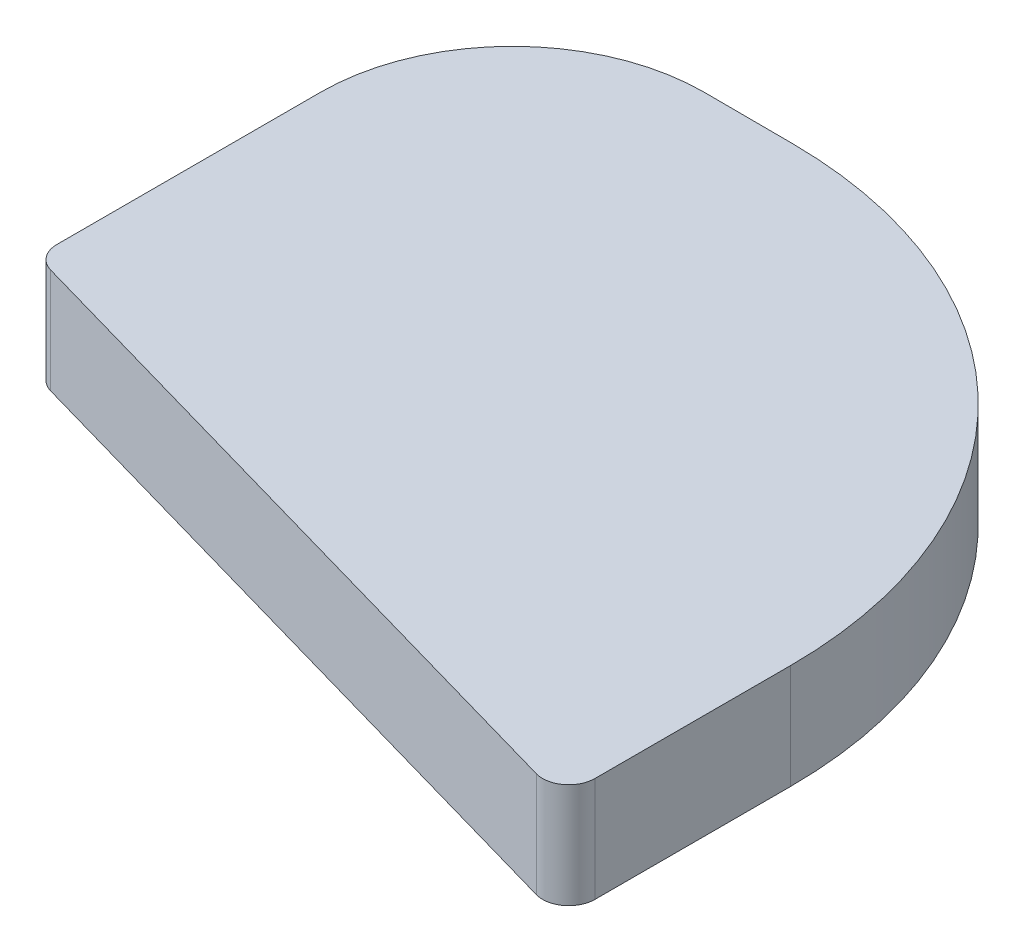
ISO-10303-21;
HEADER;
FILE_DESCRIPTION(('STEP AP214'),'2;1');
FILE_NAME('part.step','',(''),(''),'','','');
FILE_SCHEMA(('AUTOMOTIVE_DESIGN { 1 0 10303 214 1 1 1 1 }'));
ENDSEC;
DATA;
#1=APPLICATION_CONTEXT('core data for automotive mechanical design processes');
#2=APPLICATION_PROTOCOL_DEFINITION('international standard','automotive_design',2000,#1);
#3=PRODUCT_CONTEXT('',#1,'mechanical');
#4=PRODUCT('Part','Part','',(#3));
#5=PRODUCT_RELATED_PRODUCT_CATEGORY('part','',(#4));
#6=PRODUCT_DEFINITION_FORMATION('','',#4);
#7=PRODUCT_DEFINITION_CONTEXT('part definition',#1,'design');
#8=PRODUCT_DEFINITION('design','',#6,#7);
#9=PRODUCT_DEFINITION_SHAPE('','',#8);
#10=(LENGTH_UNIT() NAMED_UNIT(*) SI_UNIT(.MILLI.,.METRE.));
#11=(NAMED_UNIT(*) PLANE_ANGLE_UNIT() SI_UNIT($,.RADIAN.));
#12=(NAMED_UNIT(*) SI_UNIT($,.STERADIAN.) SOLID_ANGLE_UNIT());
#13=UNCERTAINTY_MEASURE_WITH_UNIT(LENGTH_MEASURE(1.E-05),#10,'distance_accuracy_value','');
#14=(GEOMETRIC_REPRESENTATION_CONTEXT(3) GLOBAL_UNCERTAINTY_ASSIGNED_CONTEXT((#13)) GLOBAL_UNIT_ASSIGNED_CONTEXT((#10,
#11,#12)) REPRESENTATION_CONTEXT('',''));
#15=CARTESIAN_POINT('',(0.,0.,0.));
#16=DIRECTION('',(0.,0.,1.));
#17=DIRECTION('',(1.,0.,0.));
#18=AXIS2_PLACEMENT_3D('',#15,#16,#17);
#19=CARTESIAN_POINT('',(-0.380127492938181,2.9956,-3.1192056864285));
#20=DIRECTION('',(0.,-1.,0.));
#21=DIRECTION('',(-1.,0.,0.));
#22=AXIS2_PLACEMENT_3D('',#19,#20,#21);
#23=CYLINDRICAL_SURFACE('',#22,0.281081081081106);
#24=CARTESIAN_POINT('',(-0.380127492938181,2.9306,-3.1192056864285));
#25=DIRECTION('',(0.,1.,0.));
#26=DIRECTION('',(1.,0.,0.));
#27=AXIS2_PLACEMENT_3D('',#24,#25,#26);
#28=CIRCLE('',#27,0.281081081081106);
#29=CARTESIAN_POINT('',(-0.0990464118570747,2.9306,-3.1192056864286));
#30=VERTEX_POINT('',#29);
#31=CARTESIAN_POINT('',(-0.37910340221781,2.9306,-3.4002849019176));
#32=VERTEX_POINT('',#31);
#33=EDGE_CURVE('E11',#30,#32,#28,.T.);
#34=ORIENTED_EDGE('',*,*,#33,.T.);
#35=DIRECTION('',(0.,-1.,0.));
#36=VECTOR('',#35,1.);
#37=CARTESIAN_POINT('',(-0.37910340221781,2.9956,-3.4002849019176));
#38=LINE('',#37,#36);
#39=CARTESIAN_POINT('',(-0.37910340221781,2.9956,-3.4002849019176));
#40=VERTEX_POINT('',#39);
#41=EDGE_CURVE('E24',#40,#32,#38,.T.);
#42=ORIENTED_EDGE('',*,*,#41,.F.);
#43=CARTESIAN_POINT('',(-0.380127492938181,2.9956,-3.1192056864285));
#44=DIRECTION('',(0.,1.,0.));
#45=DIRECTION('',(1.,0.,0.));
#46=AXIS2_PLACEMENT_3D('',#43,#44,#45);
#47=CIRCLE('',#46,0.281081081081106);
#48=CARTESIAN_POINT('',(-0.0990464118570747,2.9956,-3.1192056864286));
#49=VERTEX_POINT('',#48);
#50=EDGE_CURVE('E144',#49,#40,#47,.T.);
#51=ORIENTED_EDGE('',*,*,#50,.F.);
#52=DIRECTION('',(0.,-1.,0.));
#53=VECTOR('',#52,1.);
#54=CARTESIAN_POINT('',(-0.0990464118570747,2.9956,-3.1192056864286));
#55=LINE('',#54,#53);
#56=EDGE_CURVE('E102',#49,#30,#55,.T.);
#57=ORIENTED_EDGE('',*,*,#56,.T.);
#58=EDGE_LOOP('',(#34,#42,#51,#57));
#59=FACE_BOUND('',#58,.T.);
#60=ADVANCED_FACE('F17',(#59),#23,.T.);
#61=CARTESIAN_POINT('',(-0.37910340221781,2.9956,-3.4002849019176));
#62=DIRECTION('',(-0.0036433996779799,0.,0.999993362797367));
#63=DIRECTION('',(0.999993362797367,0.,0.0036433996779799));
#64=AXIS2_PLACEMENT_3D('',#61,#62,#63);
#65=PLANE('',#64);
#66=DIRECTION('',(-0.999993362797367,0.,-0.0036433996779799));
#67=VECTOR('',#66,1.);
#68=CARTESIAN_POINT('',(-0.37910340221781,2.9306,-3.4002849019176));
#69=LINE('',#68,#67);
#70=CARTESIAN_POINT('',(-0.433620918176787,2.9306,-3.400483532336));
#71=VERTEX_POINT('',#70);
#72=EDGE_CURVE('E141',#32,#71,#69,.T.);
#73=ORIENTED_EDGE('',*,*,#72,.T.);
#74=DIRECTION('',(0.,-1.,0.));
#75=VECTOR('',#74,1.);
#76=CARTESIAN_POINT('',(-0.433620918176787,2.9956,-3.400483532336));
#77=LINE('',#76,#75);
#78=CARTESIAN_POINT('',(-0.433620918176787,2.9956,-3.400483532336));
#79=VERTEX_POINT('',#78);
#80=EDGE_CURVE('E138',#79,#71,#77,.T.);
#81=ORIENTED_EDGE('',*,*,#80,.F.);
#82=DIRECTION('',(-0.999993362797367,0.,-0.0036433996779799));
#83=VECTOR('',#82,1.);
#84=CARTESIAN_POINT('',(-0.37910340221781,2.9956,-3.4002849019176));
#85=LINE('',#84,#83);
#86=EDGE_CURVE('E135',#40,#79,#85,.T.);
#87=ORIENTED_EDGE('',*,*,#86,.F.);
#88=ORIENTED_EDGE('',*,*,#41,.T.);
#89=EDGE_LOOP('',(#73,#81,#87,#88));
#90=FACE_BOUND('',#89,.T.);
#91=ADVANCED_FACE('F147',(#90),#65,.F.);
#92=CARTESIAN_POINT('',(-0.434054187327782,2.9956,-3.281565402706));
#93=DIRECTION('',(0.,-1.,0.));
#94=DIRECTION('',(-1.,0.,0.));
#95=AXIS2_PLACEMENT_3D('',#92,#93,#94);
#96=CYLINDRICAL_SURFACE('',#95,0.118918918918943);
#97=CARTESIAN_POINT('',(-0.434054187327782,2.9306,-3.281565402706));
#98=DIRECTION('',(0.,1.,0.));
#99=DIRECTION('',(1.,0.,0.));
#100=AXIS2_PLACEMENT_3D('',#97,#98,#99);
#101=CIRCLE('',#100,0.118918918918943);
#102=CARTESIAN_POINT('',(-0.552973106246725,2.9306,-3.281565402706));
#103=VERTEX_POINT('',#102);
#104=EDGE_CURVE('E133',#71,#103,#101,.T.);
#105=ORIENTED_EDGE('',*,*,#104,.T.);
#106=DIRECTION('',(0.,-1.,0.));
#107=VECTOR('',#106,1.);
#108=CARTESIAN_POINT('',(-0.552973106246725,2.9956,-3.281565402706));
#109=LINE('',#108,#107);
#110=CARTESIAN_POINT('',(-0.552973106246725,2.9956,-3.281565402706));
#111=VERTEX_POINT('',#110);
#112=EDGE_CURVE('E130',#111,#103,#109,.T.);
#113=ORIENTED_EDGE('',*,*,#112,.F.);
#114=CARTESIAN_POINT('',(-0.434054187327782,2.9956,-3.281565402706));
#115=DIRECTION('',(0.,1.,0.));
#116=DIRECTION('',(1.,0.,0.));
#117=AXIS2_PLACEMENT_3D('',#114,#115,#116);
#118=CIRCLE('',#117,0.118918918918943);
#119=EDGE_CURVE('E127',#79,#111,#118,.T.);
#120=ORIENTED_EDGE('',*,*,#119,.F.);
#121=ORIENTED_EDGE('',*,*,#80,.T.);
#122=EDGE_LOOP('',(#105,#113,#120,#121));
#123=FACE_BOUND('',#122,.T.);
#124=ADVANCED_FACE('F153',(#123),#96,.T.);
#125=CARTESIAN_POINT('',(-0.552973106246725,2.9956,-3.281565402706));
#126=DIRECTION('',(1.,0.,0.));
#127=DIRECTION('',(0.,-1.,0.));
#128=AXIS2_PLACEMENT_3D('',#125,#126,#127);
#129=PLANE('',#128);
#130=DIRECTION('',(0.,0.,1.));
#131=VECTOR('',#130,1.);
#132=CARTESIAN_POINT('',(-0.552973106246725,2.9306,-3.281565402706));
#133=LINE('',#132,#131);
#134=CARTESIAN_POINT('',(-0.552973106246725,2.9306,-3.1177696931098));
#135=VERTEX_POINT('',#134);
#136=EDGE_CURVE('E125',#103,#135,#133,.T.);
#137=ORIENTED_EDGE('',*,*,#136,.T.);
#138=DIRECTION('',(0.,-1.,0.));
#139=VECTOR('',#138,1.);
#140=CARTESIAN_POINT('',(-0.552973106246725,2.9956,-3.1177696931098));
#141=LINE('',#140,#139);
#142=CARTESIAN_POINT('',(-0.552973106246725,2.9956,-3.1177696931098));
#143=VERTEX_POINT('',#142);
#144=EDGE_CURVE('E122',#143,#135,#141,.T.);
#145=ORIENTED_EDGE('',*,*,#144,.F.);
#146=DIRECTION('',(0.,0.,1.));
#147=VECTOR('',#146,1.);
#148=CARTESIAN_POINT('',(-0.552973106246725,2.9956,-3.281565402706));
#149=LINE('',#148,#147);
#150=EDGE_CURVE('E119',#111,#143,#149,.T.);
#151=ORIENTED_EDGE('',*,*,#150,.F.);
#152=ORIENTED_EDGE('',*,*,#112,.T.);
#153=EDGE_LOOP('',(#137,#145,#151,#152));
#154=FACE_BOUND('',#153,.T.);
#155=ADVANCED_FACE('F157',(#154),#129,.F.);
#156=CARTESIAN_POINT('',(-0.536756890030488,2.9956,-3.1177696931098));
#157=DIRECTION('',(0.,-1.,0.));
#158=DIRECTION('',(-1.,0.,0.));
#159=AXIS2_PLACEMENT_3D('',#156,#157,#158);
#160=CYLINDRICAL_SURFACE('',#159,0.0162162162162374);
#161=CARTESIAN_POINT('',(-0.536756890030488,2.9306,-3.1177696931098));
#162=DIRECTION('',(0.,1.,0.));
#163=DIRECTION('',(1.,0.,0.));
#164=AXIS2_PLACEMENT_3D('',#161,#162,#163);
#165=CIRCLE('',#164,0.0162162162162374);
#166=CARTESIAN_POINT('',(-0.541197987207056,2.9306,-3.1021734652248));
#167=VERTEX_POINT('',#166);
#168=EDGE_CURVE('E117',#135,#167,#165,.T.);
#169=ORIENTED_EDGE('',*,*,#168,.T.);
#170=DIRECTION('',(0.,-1.,0.));
#171=VECTOR('',#170,1.);
#172=CARTESIAN_POINT('',(-0.541197987207056,2.9956,-3.1021734652248));
#173=LINE('',#172,#171);
#174=CARTESIAN_POINT('',(-0.541197987207056,2.9956,-3.1021734652248));
#175=VERTEX_POINT('',#174);
#176=EDGE_CURVE('E114',#175,#167,#173,.T.);
#177=ORIENTED_EDGE('',*,*,#176,.F.);
#178=CARTESIAN_POINT('',(-0.536756890030488,2.9956,-3.1177696931098));
#179=DIRECTION('',(0.,1.,0.));
#180=DIRECTION('',(1.,0.,0.));
#181=AXIS2_PLACEMENT_3D('',#178,#179,#180);
#182=CIRCLE('',#181,0.0162162162162374);
#183=EDGE_CURVE('E112',#143,#175,#182,.T.);
#184=ORIENTED_EDGE('',*,*,#183,.F.);
#185=ORIENTED_EDGE('',*,*,#144,.T.);
#186=EDGE_LOOP('',(#169,#177,#184,#185));
#187=FACE_BOUND('',#186,.T.);
#188=ADVANCED_FACE('F160',(#187),#160,.T.);
#189=CARTESIAN_POINT('',(-0.541197987207056,2.9956,-3.1021734652248));
#190=DIRECTION('',(0.273867659223336,0.,-0.961767386238237));
#191=DIRECTION('',(-0.961767386238237,0.,-0.273867659223336));
#192=AXIS2_PLACEMENT_3D('',#189,#190,#191);
#193=PLANE('',#192);
#194=DIRECTION('',(0.961767386238237,0.,0.273867659223336));
#195=VECTOR('',#194,1.);
#196=CARTESIAN_POINT('',(-0.541197987207056,2.9306,-3.1021734652248));
#197=LINE('',#196,#195);
#198=CARTESIAN_POINT('',(-0.119703725249849,2.9306,-2.9821510475904));
#199=VERTEX_POINT('',#198);
#200=EDGE_CURVE('E110',#167,#199,#197,.T.);
#201=ORIENTED_EDGE('',*,*,#200,.T.);
#202=DIRECTION('',(0.,-1.,0.));
#203=VECTOR('',#202,1.);
#204=CARTESIAN_POINT('',(-0.119703725249849,2.9956,-2.9821510475904));
#205=LINE('',#204,#203);
#206=CARTESIAN_POINT('',(-0.119703725249849,2.9956,-2.9821510475904));
#207=VERTEX_POINT('',#206);
#208=EDGE_CURVE('E108',#207,#199,#205,.T.);
#209=ORIENTED_EDGE('',*,*,#208,.F.);
#210=DIRECTION('',(0.961767386238237,0.,0.273867659223336));
#211=VECTOR('',#210,1.);
#212=CARTESIAN_POINT('',(-0.541197987207056,2.9956,-3.1021734652248));
#213=LINE('',#212,#211);
#214=EDGE_CURVE('E97',#175,#207,#213,.T.);
#215=ORIENTED_EDGE('',*,*,#214,.F.);
#216=ORIENTED_EDGE('',*,*,#176,.T.);
#217=EDGE_LOOP('',(#201,#209,#215,#216));
#218=FACE_BOUND('',#217,.T.);
#219=ADVANCED_FACE('F163',(#218),#193,.F.);
#220=CARTESIAN_POINT('',(-0.115262628073272,2.9956,-2.9977472754753));
#221=DIRECTION('',(0.,-1.,0.));
#222=DIRECTION('',(-1.,0.,0.));
#223=AXIS2_PLACEMENT_3D('',#220,#221,#222);
#224=CYLINDRICAL_SURFACE('',#223,0.016216216216197);
#225=CARTESIAN_POINT('',(-0.115262628073272,2.9306,-2.9977472754753));
#226=DIRECTION('',(0.,1.,0.));
#227=DIRECTION('',(1.,0.,0.));
#228=AXIS2_PLACEMENT_3D('',#225,#226,#227);
#229=CIRCLE('',#228,0.016216216216197);
#230=CARTESIAN_POINT('',(-0.0990464118570747,2.9306,-2.9977472754753));
#231=VERTEX_POINT('',#230);
#232=EDGE_CURVE('E84',#199,#231,#229,.T.);
#233=ORIENTED_EDGE('',*,*,#232,.T.);
#234=DIRECTION('',(0.,-1.,0.));
#235=VECTOR('',#234,1.);
#236=CARTESIAN_POINT('',(-0.0990464118570747,2.9956,-2.9977472754753));
#237=LINE('',#236,#235);
#238=CARTESIAN_POINT('',(-0.0990464118570747,2.9956,-2.9977472754753));
#239=VERTEX_POINT('',#238);
#240=EDGE_CURVE('E78',#239,#231,#237,.T.);
#241=ORIENTED_EDGE('',*,*,#240,.F.);
#242=CARTESIAN_POINT('',(-0.115262628073272,2.9956,-2.9977472754753));
#243=DIRECTION('',(0.,1.,0.));
#244=DIRECTION('',(1.,0.,0.));
#245=AXIS2_PLACEMENT_3D('',#242,#243,#244);
#246=CIRCLE('',#245,0.016216216216197);
#247=EDGE_CURVE('E82',#207,#239,#246,.T.);
#248=ORIENTED_EDGE('',*,*,#247,.F.);
#249=ORIENTED_EDGE('',*,*,#208,.T.);
#250=EDGE_LOOP('',(#233,#241,#248,#249));
#251=FACE_BOUND('',#250,.T.);
#252=ADVANCED_FACE('F80',(#251),#224,.T.);
#253=CARTESIAN_POINT('',(-0.0990464118570747,2.9956,-2.9977472754753));
#254=DIRECTION('',(-1.,0.,0.));
#255=DIRECTION('',(0.,1.,0.));
#256=AXIS2_PLACEMENT_3D('',#253,#254,#255);
#257=PLANE('',#256);
#258=DIRECTION('',(0.,0.,-1.));
#259=VECTOR('',#258,1.);
#260=CARTESIAN_POINT('',(-0.0990464118570747,2.9306,-2.9977472754753));
#261=LINE('',#260,#259);
#262=EDGE_CURVE('E98',#231,#30,#261,.T.);
#263=ORIENTED_EDGE('',*,*,#262,.T.);
#264=ORIENTED_EDGE('',*,*,#56,.F.);
#265=DIRECTION('',(0.,0.,-1.));
#266=VECTOR('',#265,1.);
#267=CARTESIAN_POINT('',(-0.0990464118570747,2.9956,-2.9977472754753));
#268=LINE('',#267,#266);
#269=EDGE_CURVE('E94',#239,#49,#268,.T.);
#270=ORIENTED_EDGE('',*,*,#269,.F.);
#271=ORIENTED_EDGE('',*,*,#240,.T.);
#272=EDGE_LOOP('',(#263,#264,#270,#271));
#273=FACE_BOUND('',#272,.T.);
#274=ADVANCED_FACE('F101',(#273),#257,.F.);
#275=CARTESIAN_POINT('',(-0.380127492938181,2.9956,-3.1192056864285));
#276=DIRECTION('',(0.,1.,0.));
#277=DIRECTION('',(1.,0.,0.));
#278=AXIS2_PLACEMENT_3D('',#275,#276,#277);
#279=PLANE('',#278);
#280=ORIENTED_EDGE('',*,*,#50,.T.);
#281=ORIENTED_EDGE('',*,*,#86,.T.);
#282=ORIENTED_EDGE('',*,*,#119,.T.);
#283=ORIENTED_EDGE('',*,*,#150,.T.);
#284=ORIENTED_EDGE('',*,*,#183,.T.);
#285=ORIENTED_EDGE('',*,*,#214,.T.);
#286=ORIENTED_EDGE('',*,*,#247,.T.);
#287=ORIENTED_EDGE('',*,*,#269,.T.);
#288=EDGE_LOOP('',(#280,#281,#282,#283,#284,#285,#286,#287));
#289=FACE_BOUND('',#288,.T.);
#290=ADVANCED_FACE('F93',(#289),#279,.T.);
#291=CARTESIAN_POINT('',(-0.380127492938181,2.9306,-3.1192056864285));
#292=DIRECTION('',(0.,1.,0.));
#293=DIRECTION('',(1.,0.,0.));
#294=AXIS2_PLACEMENT_3D('',#291,#292,#293);
#295=PLANE('',#294);
#296=ORIENTED_EDGE('',*,*,#33,.F.);
#297=ORIENTED_EDGE('',*,*,#262,.F.);
#298=ORIENTED_EDGE('',*,*,#232,.F.);
#299=ORIENTED_EDGE('',*,*,#200,.F.);
#300=ORIENTED_EDGE('',*,*,#168,.F.);
#301=ORIENTED_EDGE('',*,*,#136,.F.);
#302=ORIENTED_EDGE('',*,*,#104,.F.);
#303=ORIENTED_EDGE('',*,*,#72,.F.);
#304=EDGE_LOOP('',(#296,#297,#298,#299,#300,#301,#302,#303));
#305=FACE_BOUND('',#304,.T.);
#306=ADVANCED_FACE('F149',(#305),#295,.F.);
#307=CLOSED_SHELL('',(#60,#91,#124,#155,#188,#219,#252,#274,#290,#306));
#308=MANIFOLD_SOLID_BREP('B1',#307);
#309=ADVANCED_BREP_SHAPE_REPRESENTATION('',(#18,#308),#14);
#310=SHAPE_DEFINITION_REPRESENTATION(#9,#309);
ENDSEC;
END-ISO-10303-21;
